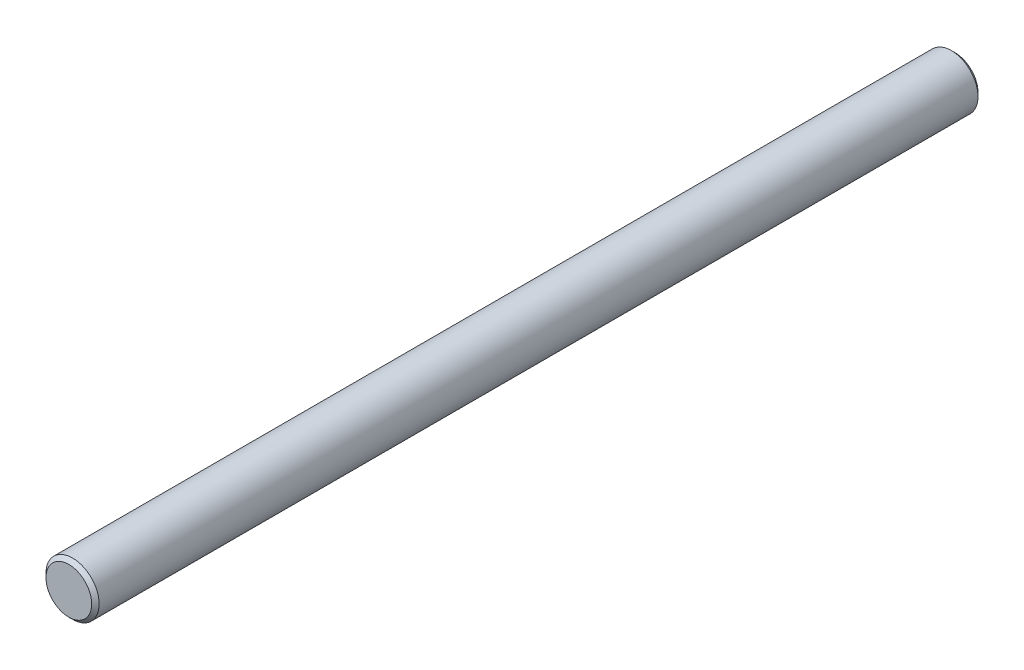
ISO-10303-21;
HEADER;
FILE_DESCRIPTION(('STEP AP214'),'2;1');
FILE_NAME('part.step','',(''),(''),'','','');
FILE_SCHEMA(('AUTOMOTIVE_DESIGN { 1 0 10303 214 1 1 1 1 }'));
ENDSEC;
DATA;
#1=APPLICATION_CONTEXT('core data for automotive mechanical design processes');
#2=APPLICATION_PROTOCOL_DEFINITION('international standard','automotive_design',2000,#1);
#3=PRODUCT_CONTEXT('',#1,'mechanical');
#4=PRODUCT('Part','Part','',(#3));
#5=PRODUCT_RELATED_PRODUCT_CATEGORY('part','',(#4));
#6=PRODUCT_DEFINITION_FORMATION('','',#4);
#7=PRODUCT_DEFINITION_CONTEXT('part definition',#1,'design');
#8=PRODUCT_DEFINITION('design','',#6,#7);
#9=PRODUCT_DEFINITION_SHAPE('','',#8);
#10=(LENGTH_UNIT() NAMED_UNIT(*) SI_UNIT(.MILLI.,.METRE.));
#11=(NAMED_UNIT(*) PLANE_ANGLE_UNIT() SI_UNIT($,.RADIAN.));
#12=(NAMED_UNIT(*) SI_UNIT($,.STERADIAN.) SOLID_ANGLE_UNIT());
#13=UNCERTAINTY_MEASURE_WITH_UNIT(LENGTH_MEASURE(1.E-05),#10,'distance_accuracy_value','');
#14=(GEOMETRIC_REPRESENTATION_CONTEXT(3) GLOBAL_UNCERTAINTY_ASSIGNED_CONTEXT((#13)) GLOBAL_UNIT_ASSIGNED_CONTEXT((#10,
#11,#12)) REPRESENTATION_CONTEXT('',''));
#15=CARTESIAN_POINT('',(0.,0.,0.));
#16=DIRECTION('',(0.,0.,1.));
#17=DIRECTION('',(1.,0.,0.));
#18=AXIS2_PLACEMENT_3D('',#15,#16,#17);
#19=CARTESIAN_POINT('',(0.,0.,50.));
#20=DIRECTION('',(0.,0.,-1.));
#21=DIRECTION('',(-1.,0.,0.));
#22=AXIS2_PLACEMENT_3D('',#19,#20,#21);
#23=CYLINDRICAL_SURFACE('',#22,3.);
#24=CARTESIAN_POINT('',(0.,0.,-49.58));
#25=DIRECTION('',(0.,0.,1.));
#26=DIRECTION('',(1.,0.,0.));
#27=AXIS2_PLACEMENT_3D('',#24,#25,#26);
#28=CIRCLE('',#27,3.);
#29=CARTESIAN_POINT('',(3.,0.,-49.58));
#30=VERTEX_POINT('',#29);
#31=EDGE_CURVE('E54',#30,#30,#28,.T.);
#32=ORIENTED_EDGE('',*,*,#31,.T.);
#33=EDGE_LOOP('',(#32));
#34=FACE_BOUND('',#33,.T.);
#35=CARTESIAN_POINT('',(0.,0.,49.58));
#36=DIRECTION('',(0.,0.,1.));
#37=DIRECTION('',(1.,0.,0.));
#38=AXIS2_PLACEMENT_3D('',#35,#36,#37);
#39=CIRCLE('',#38,3.);
#40=CARTESIAN_POINT('',(3.,0.,49.58));
#41=VERTEX_POINT('',#40);
#42=EDGE_CURVE('E63',#41,#41,#39,.F.);
#43=ORIENTED_EDGE('',*,*,#42,.T.);
#44=EDGE_LOOP('',(#43));
#45=FACE_BOUND('',#44,.T.);
#46=ADVANCED_FACE('F41',(#34,#45),#23,.T.);
#47=CARTESIAN_POINT('',(0.,0.,50.));
#48=DIRECTION('',(0.,0.,1.));
#49=DIRECTION('',(1.,0.,0.));
#50=AXIS2_PLACEMENT_3D('',#47,#48,#49);
#51=PLANE('',#50);
#52=CARTESIAN_POINT('',(0.,0.,50.));
#53=DIRECTION('',(0.,0.,1.));
#54=DIRECTION('',(1.,0.,0.));
#55=AXIS2_PLACEMENT_3D('',#52,#53,#54);
#56=CIRCLE('',#55,2.58);
#57=CARTESIAN_POINT('',(2.58,0.,50.));
#58=VERTEX_POINT('',#57);
#59=EDGE_CURVE('E10',#58,#58,#56,.T.);
#60=ORIENTED_EDGE('',*,*,#59,.T.);
#61=EDGE_LOOP('',(#60));
#62=FACE_BOUND('',#61,.T.);
#63=ADVANCED_FACE('F76',(#62),#51,.T.);
#64=CARTESIAN_POINT('',(0.,0.,-50.));
#65=DIRECTION('',(0.,0.,1.));
#66=DIRECTION('',(1.,0.,0.));
#67=AXIS2_PLACEMENT_3D('',#64,#65,#66);
#68=PLANE('',#67);
#69=CARTESIAN_POINT('',(0.,0.,-50.));
#70=DIRECTION('',(0.,0.,1.));
#71=DIRECTION('',(1.,0.,0.));
#72=AXIS2_PLACEMENT_3D('',#69,#70,#71);
#73=CIRCLE('',#72,2.58);
#74=CARTESIAN_POINT('',(2.58,0.,-50.));
#75=VERTEX_POINT('',#74);
#76=EDGE_CURVE('E47',#75,#75,#73,.F.);
#77=ORIENTED_EDGE('',*,*,#76,.T.);
#78=EDGE_LOOP('',(#77));
#79=FACE_BOUND('',#78,.T.);
#80=ADVANCED_FACE('F77',(#79),#68,.F.);
#81=CARTESIAN_POINT('',(0.,0.,-49.58));
#82=DIRECTION('',(0.,0.,1.));
#83=DIRECTION('',(1.,0.,0.));
#84=AXIS2_PLACEMENT_3D('',#81,#82,#83);
#85=CONICAL_SURFACE('',#84,3.,0.785398163397446);
#86=CARTESIAN_POINT('',(2.58,0.,-50.));
#87=CARTESIAN_POINT('',(2.584375,0.,-49.995625));
#88=CARTESIAN_POINT('',(2.58875,0.,-49.99125));
#89=CARTESIAN_POINT('',(2.5975,0.,-49.9825));
#90=CARTESIAN_POINT('',(2.60187499999999,0.,-49.978125));
#91=CARTESIAN_POINT('',(2.610625,0.,-49.969375));
#92=CARTESIAN_POINT('',(2.615,0.,-49.965));
#93=CARTESIAN_POINT('',(2.62375,0.,-49.95625));
#94=CARTESIAN_POINT('',(2.628125,0.,-49.951875));
#95=CARTESIAN_POINT('',(2.63687499999999,0.,-49.943125));
#96=CARTESIAN_POINT('',(2.64124999999999,0.,-49.93875));
#97=CARTESIAN_POINT('',(2.65,0.,-49.93));
#98=CARTESIAN_POINT('',(2.654375,0.,-49.925625));
#99=CARTESIAN_POINT('',(2.663125,0.,-49.916875));
#100=CARTESIAN_POINT('',(2.6675,0.,-49.9125));
#101=CARTESIAN_POINT('',(2.67625,0.,-49.90375));
#102=CARTESIAN_POINT('',(2.680625,0.,-49.899375));
#103=CARTESIAN_POINT('',(2.689375,0.,-49.890625));
#104=CARTESIAN_POINT('',(2.69375,0.,-49.88625));
#105=CARTESIAN_POINT('',(2.7025,0.,-49.8775));
#106=CARTESIAN_POINT('',(2.70687499999999,0.,-49.873125));
#107=CARTESIAN_POINT('',(2.715625,0.,-49.864375));
#108=CARTESIAN_POINT('',(2.72,0.,-49.86));
#109=CARTESIAN_POINT('',(2.72875,0.,-49.85125));
#110=CARTESIAN_POINT('',(2.733125,0.,-49.846875));
#111=CARTESIAN_POINT('',(2.741875,0.,-49.838125));
#112=CARTESIAN_POINT('',(2.74625,0.,-49.83375));
#113=CARTESIAN_POINT('',(2.755,0.,-49.825));
#114=CARTESIAN_POINT('',(2.759375,0.,-49.820625));
#115=CARTESIAN_POINT('',(2.768125,0.,-49.811875));
#116=CARTESIAN_POINT('',(2.7725,0.,-49.8075));
#117=CARTESIAN_POINT('',(2.78125,0.,-49.79875));
#118=CARTESIAN_POINT('',(2.785625,0.,-49.794375));
#119=CARTESIAN_POINT('',(2.794375,0.,-49.785625));
#120=CARTESIAN_POINT('',(2.79875,0.,-49.78125));
#121=CARTESIAN_POINT('',(2.8075,0.,-49.7725));
#122=CARTESIAN_POINT('',(2.811875,0.,-49.768125));
#123=CARTESIAN_POINT('',(2.820625,0.,-49.759375));
#124=CARTESIAN_POINT('',(2.825,0.,-49.755));
#125=CARTESIAN_POINT('',(2.83375,0.,-49.74625));
#126=CARTESIAN_POINT('',(2.838125,0.,-49.741875));
#127=CARTESIAN_POINT('',(2.846875,0.,-49.733125));
#128=CARTESIAN_POINT('',(2.85125,0.,-49.72875));
#129=CARTESIAN_POINT('',(2.86,0.,-49.72));
#130=CARTESIAN_POINT('',(2.864375,0.,-49.715625));
#131=CARTESIAN_POINT('',(2.873125,0.,-49.706875));
#132=CARTESIAN_POINT('',(2.8775,0.,-49.7025));
#133=CARTESIAN_POINT('',(2.88625,0.,-49.69375));
#134=CARTESIAN_POINT('',(2.890625,0.,-49.689375));
#135=CARTESIAN_POINT('',(2.899375,0.,-49.680625));
#136=CARTESIAN_POINT('',(2.90375,0.,-49.67625));
#137=CARTESIAN_POINT('',(2.9125,0.,-49.6675));
#138=CARTESIAN_POINT('',(2.916875,0.,-49.663125));
#139=CARTESIAN_POINT('',(2.925625,0.,-49.654375));
#140=CARTESIAN_POINT('',(2.93,0.,-49.65));
#141=CARTESIAN_POINT('',(2.93875,0.,-49.64125));
#142=CARTESIAN_POINT('',(2.943125,0.,-49.636875));
#143=CARTESIAN_POINT('',(2.951875,0.,-49.628125));
#144=CARTESIAN_POINT('',(2.95625,0.,-49.62375));
#145=CARTESIAN_POINT('',(2.965,0.,-49.615));
#146=CARTESIAN_POINT('',(2.969375,0.,-49.610625));
#147=CARTESIAN_POINT('',(2.978125,0.,-49.601875));
#148=CARTESIAN_POINT('',(2.9825,0.,-49.5975));
#149=CARTESIAN_POINT('',(2.99125,0.,-49.58875));
#150=CARTESIAN_POINT('',(2.995625,0.,-49.584375));
#151=CARTESIAN_POINT('',(3.,0.,-49.58));
#152=B_SPLINE_CURVE_WITH_KNOTS('',3,(#86,#87,#88,#89,#90,#91,#92,#93,#94,#95,#96,#97,#98,#99,
#100,#101,#102,#103,#104,#105,#106,#107,#108,#109,#110,#111,#112,#113,#114,#115,#116,#117,#118,
#119,#120,#121,#122,#123,#124,#125,#126,#127,#128,#129,#130,#131,#132,#133,#134,#135,#136,#137,
#138,#139,#140,#141,#142,#143,#144,#145,#146,#147,#148,#149,#150,#151),.UNSPECIFIED.,.F.,.F.,(4,
2,2,2,2,2,2,2,2,2,2,2,2,2,2,2,2,2,2,2,2,2,2,2,2,2,2,2,2,2,2,2,4),(0.,0.0185615530061489,
0.0371231060122978,0.0556846590184414,0.0742462120245903,0.0928077650307392,0.111369318036883,
0.129930871043032,0.148492424049176,0.167053977055325,0.185615530061473,0.204177083067617,
0.222738636073766,0.241300189079915,0.259861742086059,0.278423295092208,0.296984848098352,
0.3155464011045,0.334107954110649,0.352669507116793,0.371231060122942,0.389792613129091,
0.408354166135235,0.426915719141384,0.445477272147532,0.464038825153676,0.482600378159825,
0.501161931165969,0.519723484172118,0.538285037178267,0.556846590184411,0.575408143190559,
0.593969696196708),.UNSPECIFIED.);
#153=EDGE_CURVE('BSEAM75',#75,#30,#152,.T.);
#154=ORIENTED_EDGE('',*,*,#76,.F.);
#155=ORIENTED_EDGE('',*,*,#31,.F.);
#156=ORIENTED_EDGE('',*,*,#153,.T.);
#157=ORIENTED_EDGE('',*,*,#153,.F.);
#158=EDGE_LOOP('',(#154,#156,#155,#157));
#159=FACE_BOUND('',#158,.T.);
#160=ADVANCED_FACE('F75',(#159),#85,.T.);
#161=CARTESIAN_POINT('',(0.,0.,50.));
#162=DIRECTION('',(0.,0.,-1.));
#163=DIRECTION('',(-1.,0.,0.));
#164=AXIS2_PLACEMENT_3D('',#161,#162,#163);
#165=CONICAL_SURFACE('',#164,2.58,0.785398163397453);
#166=ORIENTED_EDGE('',*,*,#42,.F.);
#167=EDGE_LOOP('',(#166));
#168=FACE_BOUND('',#167,.T.);
#169=ORIENTED_EDGE('',*,*,#59,.F.);
#170=EDGE_LOOP('',(#169));
#171=FACE_BOUND('',#170,.T.);
#172=ADVANCED_FACE('F43',(#168,#171),#165,.T.);
#173=CLOSED_SHELL('',(#46,#63,#80,#160,#172));
#174=MANIFOLD_SOLID_BREP('B2',#173);
#175=ADVANCED_BREP_SHAPE_REPRESENTATION('',(#18,#174),#14);
#176=SHAPE_DEFINITION_REPRESENTATION(#9,#175);
ENDSEC;
END-ISO-10303-21;
